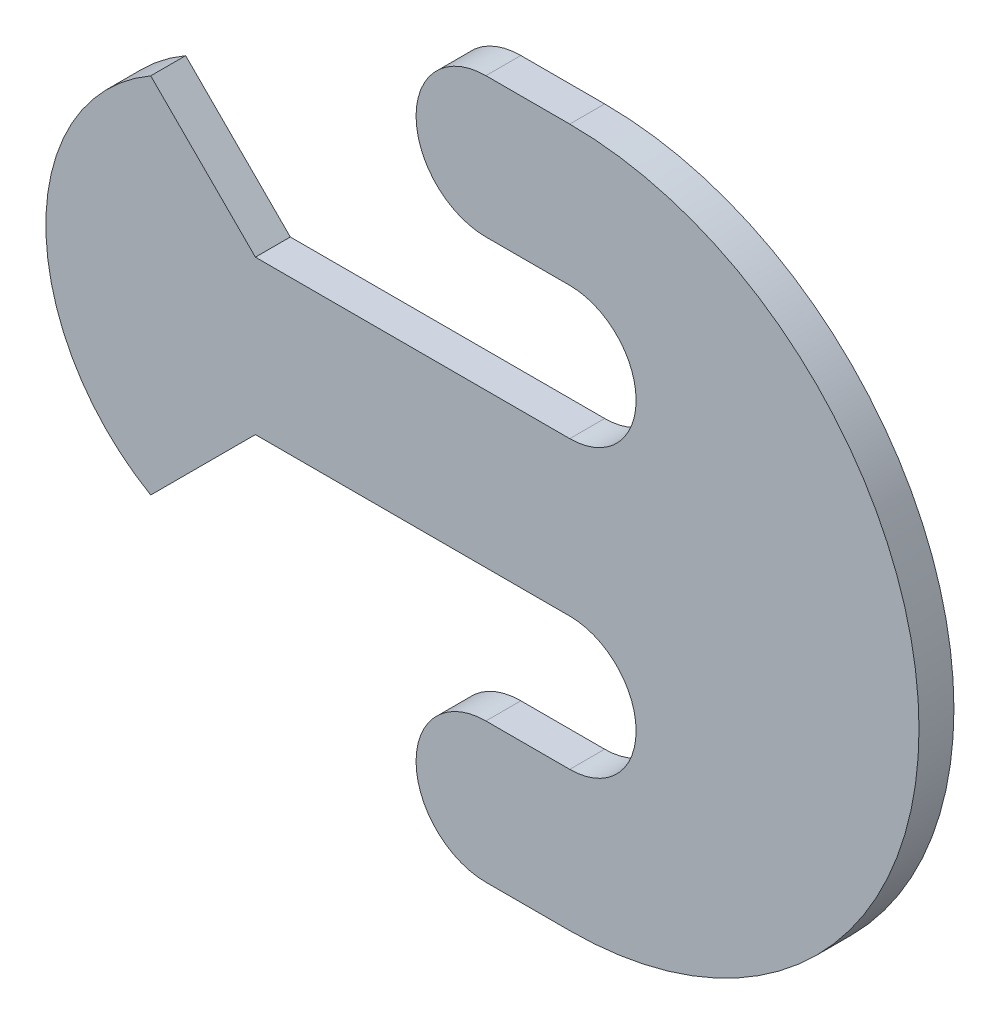
ISO-10303-21;
HEADER;
FILE_DESCRIPTION(('STEP AP214'),'2;1');
FILE_NAME('part.step','',(''),(''),'','','');
FILE_SCHEMA(('AUTOMOTIVE_DESIGN { 1 0 10303 214 1 1 1 1 }'));
ENDSEC;
DATA;
#1=APPLICATION_CONTEXT('core data for automotive mechanical design processes');
#2=APPLICATION_PROTOCOL_DEFINITION('international standard','automotive_design',2000,#1);
#3=PRODUCT_CONTEXT('',#1,'mechanical');
#4=PRODUCT('Part','Part','',(#3));
#5=PRODUCT_RELATED_PRODUCT_CATEGORY('part','',(#4));
#6=PRODUCT_DEFINITION_FORMATION('','',#4);
#7=PRODUCT_DEFINITION_CONTEXT('part definition',#1,'design');
#8=PRODUCT_DEFINITION('design','',#6,#7);
#9=PRODUCT_DEFINITION_SHAPE('','',#8);
#10=(LENGTH_UNIT() NAMED_UNIT(*) SI_UNIT(.MILLI.,.METRE.));
#11=(NAMED_UNIT(*) PLANE_ANGLE_UNIT() SI_UNIT($,.RADIAN.));
#12=(NAMED_UNIT(*) SI_UNIT($,.STERADIAN.) SOLID_ANGLE_UNIT());
#13=UNCERTAINTY_MEASURE_WITH_UNIT(LENGTH_MEASURE(1.E-05),#10,'distance_accuracy_value','');
#14=(GEOMETRIC_REPRESENTATION_CONTEXT(3) GLOBAL_UNCERTAINTY_ASSIGNED_CONTEXT((#13)) GLOBAL_UNIT_ASSIGNED_CONTEXT((#10,
#11,#12)) REPRESENTATION_CONTEXT('',''));
#15=CARTESIAN_POINT('',(0.,0.,0.));
#16=DIRECTION('',(0.,0.,1.));
#17=DIRECTION('',(1.,0.,0.));
#18=AXIS2_PLACEMENT_3D('',#15,#16,#17);
#19=CARTESIAN_POINT('',(11.,11.,5.));
#20=DIRECTION('',(-0.707106781186546,-0.707106781186549,0.));
#21=DIRECTION('',(0.707106781186549,-0.707106781186546,0.));
#22=AXIS2_PLACEMENT_3D('',#19,#20,#21);
#23=PLANE('',#22);
#24=DIRECTION('',(-0.707106781186549,0.707106781186546,0.));
#25=VECTOR('',#24,1.);
#26=CARTESIAN_POINT('',(11.,11.,0.));
#27=LINE('',#26,#25);
#28=CARTESIAN_POINT('',(0.,22.,0.));
#29=VERTEX_POINT('',#28);
#30=CARTESIAN_POINT('',(-14.9878012485479,36.9878012485478,0.));
#31=VERTEX_POINT('',#30);
#32=EDGE_CURVE('E168',#29,#31,#27,.T.);
#33=ORIENTED_EDGE('',*,*,#32,.T.);
#34=DIRECTION('',(0.,0.,-1.));
#35=VECTOR('',#34,1.);
#36=CARTESIAN_POINT('',(-14.9878012485479,36.9878012485478,5.));
#37=LINE('',#36,#35);
#38=CARTESIAN_POINT('',(-14.9878012485479,36.9878012485478,5.));
#39=VERTEX_POINT('',#38);
#40=EDGE_CURVE('E11',#39,#31,#37,.T.);
#41=ORIENTED_EDGE('',*,*,#40,.F.);
#42=DIRECTION('',(-0.707106781186549,0.707106781186546,0.));
#43=VECTOR('',#42,1.);
#44=CARTESIAN_POINT('',(11.,11.,5.));
#45=LINE('',#44,#43);
#46=CARTESIAN_POINT('',(0.,22.,5.));
#47=VERTEX_POINT('',#46);
#48=EDGE_CURVE('E203',#47,#39,#45,.T.);
#49=ORIENTED_EDGE('',*,*,#48,.F.);
#50=DIRECTION('',(0.,0.,-1.));
#51=VECTOR('',#50,1.);
#52=CARTESIAN_POINT('',(0.,22.,5.));
#53=LINE('',#52,#51);
#54=EDGE_CURVE('E51',#47,#29,#53,.T.);
#55=ORIENTED_EDGE('',*,*,#54,.T.);
#56=EDGE_LOOP('',(#33,#41,#49,#55));
#57=FACE_BOUND('',#56,.T.);
#58=ADVANCED_FACE('F35',(#57),#23,.F.);
#59=CARTESIAN_POINT('',(0.,11.,5.));
#60=DIRECTION('',(0.,0.,-1.));
#61=DIRECTION('',(-1.,0.,0.));
#62=AXIS2_PLACEMENT_3D('',#59,#60,#61);
#63=CYLINDRICAL_SURFACE('',#62,30.);
#64=CARTESIAN_POINT('',(0.,11.,0.));
#65=DIRECTION('',(0.,0.,1.));
#66=DIRECTION('',(1.,0.,0.));
#67=AXIS2_PLACEMENT_3D('',#64,#65,#66);
#68=CIRCLE('',#67,30.);
#69=CARTESIAN_POINT('',(-14.9878012485479,-14.9878012485479,0.));
#70=VERTEX_POINT('',#69);
#71=EDGE_CURVE('E170',#31,#70,#68,.T.);
#72=ORIENTED_EDGE('',*,*,#71,.T.);
#73=DIRECTION('',(0.,0.,-1.));
#74=VECTOR('',#73,1.);
#75=CARTESIAN_POINT('',(-14.9878012485479,-14.9878012485479,5.));
#76=LINE('',#75,#74);
#77=CARTESIAN_POINT('',(-14.9878012485479,-14.9878012485479,5.));
#78=VERTEX_POINT('',#77);
#79=EDGE_CURVE('E43',#78,#70,#76,.T.);
#80=ORIENTED_EDGE('',*,*,#79,.F.);
#81=CARTESIAN_POINT('',(0.,11.,5.));
#82=DIRECTION('',(0.,0.,1.));
#83=DIRECTION('',(1.,0.,0.));
#84=AXIS2_PLACEMENT_3D('',#81,#82,#83);
#85=CIRCLE('',#84,30.);
#86=EDGE_CURVE('E107',#39,#78,#85,.T.);
#87=ORIENTED_EDGE('',*,*,#86,.F.);
#88=ORIENTED_EDGE('',*,*,#40,.T.);
#89=EDGE_LOOP('',(#72,#80,#87,#88));
#90=FACE_BOUND('',#89,.T.);
#91=ADVANCED_FACE('F230',(#90),#63,.T.);
#92=CARTESIAN_POINT('',(0.,0.,5.));
#93=DIRECTION('',(0.707106781186546,-0.707106781186549,0.));
#94=DIRECTION('',(0.707106781186549,0.707106781186546,0.));
#95=AXIS2_PLACEMENT_3D('',#92,#93,#94);
#96=PLANE('',#95);
#97=DIRECTION('',(-0.707106781186549,-0.707106781186546,0.));
#98=VECTOR('',#97,1.);
#99=CARTESIAN_POINT('',(0.,0.,0.));
#100=LINE('',#99,#98);
#101=CARTESIAN_POINT('',(0.,0.,0.));
#102=VERTEX_POINT('',#101);
#103=EDGE_CURVE('E173',#102,#70,#100,.T.);
#104=ORIENTED_EDGE('',*,*,#103,.F.);
#105=DIRECTION('',(0.,0.,-1.));
#106=VECTOR('',#105,1.);
#107=CARTESIAN_POINT('',(0.,0.,5.));
#108=LINE('',#107,#106);
#109=CARTESIAN_POINT('',(0.,0.,5.));
#110=VERTEX_POINT('',#109);
#111=EDGE_CURVE('E223',#110,#102,#108,.T.);
#112=ORIENTED_EDGE('',*,*,#111,.F.);
#113=DIRECTION('',(-0.707106781186549,-0.707106781186546,0.));
#114=VECTOR('',#113,1.);
#115=CARTESIAN_POINT('',(0.,0.,5.));
#116=LINE('',#115,#114);
#117=EDGE_CURVE('E229',#110,#78,#116,.T.);
#118=ORIENTED_EDGE('',*,*,#117,.T.);
#119=ORIENTED_EDGE('',*,*,#79,.T.);
#120=EDGE_LOOP('',(#104,#112,#118,#119));
#121=FACE_BOUND('',#120,.T.);
#122=ADVANCED_FACE('F227',(#121),#96,.T.);
#123=CARTESIAN_POINT('',(0.,0.,5.));
#124=DIRECTION('',(0.,1.,0.));
#125=DIRECTION('',(0.,0.,1.));
#126=AXIS2_PLACEMENT_3D('',#123,#124,#125);
#127=PLANE('',#126);
#128=DIRECTION('',(1.,0.,0.));
#129=VECTOR('',#128,1.);
#130=CARTESIAN_POINT('',(0.,0.,0.));
#131=LINE('',#130,#129);
#132=CARTESIAN_POINT('',(45.,0.,0.));
#133=VERTEX_POINT('',#132);
#134=EDGE_CURVE('E176',#102,#133,#131,.T.);
#135=ORIENTED_EDGE('',*,*,#134,.T.);
#136=DIRECTION('',(0.,0.,-1.));
#137=VECTOR('',#136,1.);
#138=CARTESIAN_POINT('',(45.,0.,5.));
#139=LINE('',#138,#137);
#140=CARTESIAN_POINT('',(45.,0.,5.));
#141=VERTEX_POINT('',#140);
#142=EDGE_CURVE('E221',#141,#133,#139,.T.);
#143=ORIENTED_EDGE('',*,*,#142,.F.);
#144=DIRECTION('',(1.,0.,0.));
#145=VECTOR('',#144,1.);
#146=CARTESIAN_POINT('',(0.,0.,5.));
#147=LINE('',#146,#145);
#148=EDGE_CURVE('E241',#110,#141,#147,.T.);
#149=ORIENTED_EDGE('',*,*,#148,.F.);
#150=ORIENTED_EDGE('',*,*,#111,.T.);
#151=EDGE_LOOP('',(#135,#143,#149,#150));
#152=FACE_BOUND('',#151,.T.);
#153=ADVANCED_FACE('F238',(#152),#127,.F.);
#154=CARTESIAN_POINT('',(45.,-9.49999999999999,5.));
#155=DIRECTION('',(0.,0.,-1.));
#156=DIRECTION('',(-1.,0.,0.));
#157=AXIS2_PLACEMENT_3D('',#154,#155,#156);
#158=CYLINDRICAL_SURFACE('',#157,9.49999999999999);
#159=CARTESIAN_POINT('',(45.,-9.49999999999999,0.));
#160=DIRECTION('',(0.,0.,1.));
#161=DIRECTION('',(1.,0.,0.));
#162=AXIS2_PLACEMENT_3D('',#159,#160,#161);
#163=CIRCLE('',#162,9.49999999999999);
#164=CARTESIAN_POINT('',(45.,-19.,0.));
#165=VERTEX_POINT('',#164);
#166=EDGE_CURVE('E179',#165,#133,#163,.T.);
#167=ORIENTED_EDGE('',*,*,#166,.F.);
#168=DIRECTION('',(0.,0.,-1.));
#169=VECTOR('',#168,1.);
#170=CARTESIAN_POINT('',(45.,-19.,5.));
#171=LINE('',#170,#169);
#172=CARTESIAN_POINT('',(45.,-19.,5.));
#173=VERTEX_POINT('',#172);
#174=EDGE_CURVE('E219',#173,#165,#171,.T.);
#175=ORIENTED_EDGE('',*,*,#174,.F.);
#176=CARTESIAN_POINT('',(45.,-9.49999999999999,5.));
#177=DIRECTION('',(0.,0.,1.));
#178=DIRECTION('',(1.,0.,0.));
#179=AXIS2_PLACEMENT_3D('',#176,#177,#178);
#180=CIRCLE('',#179,9.49999999999999);
#181=EDGE_CURVE('E243',#173,#141,#180,.T.);
#182=ORIENTED_EDGE('',*,*,#181,.T.);
#183=ORIENTED_EDGE('',*,*,#142,.T.);
#184=EDGE_LOOP('',(#167,#175,#182,#183));
#185=FACE_BOUND('',#184,.T.);
#186=ADVANCED_FACE('F293',(#185),#158,.F.);
#187=CARTESIAN_POINT('',(0.,-19.,5.));
#188=DIRECTION('',(0.,1.,0.));
#189=DIRECTION('',(0.,0.,1.));
#190=AXIS2_PLACEMENT_3D('',#187,#188,#189);
#191=PLANE('',#190);
#192=DIRECTION('',(1.,0.,0.));
#193=VECTOR('',#192,1.);
#194=CARTESIAN_POINT('',(0.,-19.,0.));
#195=LINE('',#194,#193);
#196=CARTESIAN_POINT('',(33.,-19.,0.));
#197=VERTEX_POINT('',#196);
#198=EDGE_CURVE('E182',#197,#165,#195,.T.);
#199=ORIENTED_EDGE('',*,*,#198,.F.);
#200=DIRECTION('',(0.,0.,-1.));
#201=VECTOR('',#200,1.);
#202=CARTESIAN_POINT('',(33.,-19.,5.));
#203=LINE('',#202,#201);
#204=CARTESIAN_POINT('',(33.,-19.,5.));
#205=VERTEX_POINT('',#204);
#206=EDGE_CURVE('E217',#205,#197,#203,.T.);
#207=ORIENTED_EDGE('',*,*,#206,.F.);
#208=DIRECTION('',(1.,0.,0.));
#209=VECTOR('',#208,1.);
#210=CARTESIAN_POINT('',(0.,-19.,5.));
#211=LINE('',#210,#209);
#212=EDGE_CURVE('E250',#205,#173,#211,.T.);
#213=ORIENTED_EDGE('',*,*,#212,.T.);
#214=ORIENTED_EDGE('',*,*,#174,.T.);
#215=EDGE_LOOP('',(#199,#207,#213,#214));
#216=FACE_BOUND('',#215,.T.);
#217=ADVANCED_FACE('F296',(#216),#191,.T.);
#218=CARTESIAN_POINT('',(33.,-29.,5.));
#219=DIRECTION('',(0.,0.,-1.));
#220=DIRECTION('',(-1.,0.,0.));
#221=AXIS2_PLACEMENT_3D('',#218,#219,#220);
#222=CYLINDRICAL_SURFACE('',#221,10.);
#223=CARTESIAN_POINT('',(33.,-29.,0.));
#224=DIRECTION('',(0.,0.,1.));
#225=DIRECTION('',(1.,0.,0.));
#226=AXIS2_PLACEMENT_3D('',#223,#224,#225);
#227=CIRCLE('',#226,10.);
#228=CARTESIAN_POINT('',(33.,-39.,0.));
#229=VERTEX_POINT('',#228);
#230=EDGE_CURVE('E185',#197,#229,#227,.T.);
#231=ORIENTED_EDGE('',*,*,#230,.T.);
#232=DIRECTION('',(0.,0.,-1.));
#233=VECTOR('',#232,1.);
#234=CARTESIAN_POINT('',(33.,-39.,5.));
#235=LINE('',#234,#233);
#236=CARTESIAN_POINT('',(33.,-39.,5.));
#237=VERTEX_POINT('',#236);
#238=EDGE_CURVE('E215',#237,#229,#235,.T.);
#239=ORIENTED_EDGE('',*,*,#238,.F.);
#240=CARTESIAN_POINT('',(33.,-29.,5.));
#241=DIRECTION('',(0.,0.,1.));
#242=DIRECTION('',(1.,0.,0.));
#243=AXIS2_PLACEMENT_3D('',#240,#241,#242);
#244=CIRCLE('',#243,10.);
#245=EDGE_CURVE('E253',#205,#237,#244,.T.);
#246=ORIENTED_EDGE('',*,*,#245,.F.);
#247=ORIENTED_EDGE('',*,*,#206,.T.);
#248=EDGE_LOOP('',(#231,#239,#246,#247));
#249=FACE_BOUND('',#248,.T.);
#250=ADVANCED_FACE('F300',(#249),#222,.T.);
#251=CARTESIAN_POINT('',(0.,-39.,5.));
#252=DIRECTION('',(0.,-1.,0.));
#253=DIRECTION('',(0.,0.,-1.));
#254=AXIS2_PLACEMENT_3D('',#251,#252,#253);
#255=PLANE('',#254);
#256=DIRECTION('',(-1.,0.,0.));
#257=VECTOR('',#256,1.);
#258=CARTESIAN_POINT('',(0.,-39.,0.));
#259=LINE('',#258,#257);
#260=CARTESIAN_POINT('',(45.,-39.,0.));
#261=VERTEX_POINT('',#260);
#262=EDGE_CURVE('E188',#261,#229,#259,.T.);
#263=ORIENTED_EDGE('',*,*,#262,.F.);
#264=DIRECTION('',(0.,0.,-1.));
#265=VECTOR('',#264,1.);
#266=CARTESIAN_POINT('',(45.,-39.,5.));
#267=LINE('',#266,#265);
#268=CARTESIAN_POINT('',(45.,-39.,5.));
#269=VERTEX_POINT('',#268);
#270=EDGE_CURVE('E213',#269,#261,#267,.T.);
#271=ORIENTED_EDGE('',*,*,#270,.F.);
#272=DIRECTION('',(-1.,0.,0.));
#273=VECTOR('',#272,1.);
#274=CARTESIAN_POINT('',(0.,-39.,5.));
#275=LINE('',#274,#273);
#276=EDGE_CURVE('E255',#269,#237,#275,.T.);
#277=ORIENTED_EDGE('',*,*,#276,.T.);
#278=ORIENTED_EDGE('',*,*,#238,.T.);
#279=EDGE_LOOP('',(#263,#271,#277,#278));
#280=FACE_BOUND('',#279,.T.);
#281=ADVANCED_FACE('F304',(#280),#255,.T.);
#282=CARTESIAN_POINT('',(45.,11.,5.));
#283=DIRECTION('',(0.,0.,-1.));
#284=DIRECTION('',(-1.,0.,0.));
#285=AXIS2_PLACEMENT_3D('',#282,#283,#284);
#286=CYLINDRICAL_SURFACE('',#285,50.);
#287=CARTESIAN_POINT('',(45.,11.,0.));
#288=DIRECTION('',(0.,0.,1.));
#289=DIRECTION('',(1.,0.,0.));
#290=AXIS2_PLACEMENT_3D('',#287,#288,#289);
#291=CIRCLE('',#290,50.);
#292=CARTESIAN_POINT('',(45.,61.,0.));
#293=VERTEX_POINT('',#292);
#294=EDGE_CURVE('E191',#261,#293,#291,.T.);
#295=ORIENTED_EDGE('',*,*,#294,.T.);
#296=DIRECTION('',(0.,0.,-1.));
#297=VECTOR('',#296,1.);
#298=CARTESIAN_POINT('',(45.,61.,5.));
#299=LINE('',#298,#297);
#300=CARTESIAN_POINT('',(45.,61.,5.));
#301=VERTEX_POINT('',#300);
#302=EDGE_CURVE('E210',#301,#293,#299,.T.);
#303=ORIENTED_EDGE('',*,*,#302,.F.);
#304=CARTESIAN_POINT('',(45.,11.,5.));
#305=DIRECTION('',(0.,0.,1.));
#306=DIRECTION('',(1.,0.,0.));
#307=AXIS2_PLACEMENT_3D('',#304,#305,#306);
#308=CIRCLE('',#307,50.);
#309=EDGE_CURVE('E258',#269,#301,#308,.T.);
#310=ORIENTED_EDGE('',*,*,#309,.F.);
#311=ORIENTED_EDGE('',*,*,#270,.T.);
#312=EDGE_LOOP('',(#295,#303,#310,#311));
#313=FACE_BOUND('',#312,.T.);
#314=ADVANCED_FACE('F308',(#313),#286,.T.);
#315=CARTESIAN_POINT('',(0.,61.,5.));
#316=DIRECTION('',(0.,-1.,0.));
#317=DIRECTION('',(1.,0.,0.));
#318=AXIS2_PLACEMENT_3D('',#315,#316,#317);
#319=PLANE('',#318);
#320=DIRECTION('',(-1.,0.,0.));
#321=VECTOR('',#320,1.);
#322=CARTESIAN_POINT('',(0.,61.,0.));
#323=LINE('',#322,#321);
#324=CARTESIAN_POINT('',(33.,61.,0.));
#325=VERTEX_POINT('',#324);
#326=EDGE_CURVE('E193',#293,#325,#323,.T.);
#327=ORIENTED_EDGE('',*,*,#326,.T.);
#328=DIRECTION('',(0.,0.,-1.));
#329=VECTOR('',#328,1.);
#330=CARTESIAN_POINT('',(33.,61.,5.));
#331=LINE('',#330,#329);
#332=CARTESIAN_POINT('',(33.,61.,5.));
#333=VERTEX_POINT('',#332);
#334=EDGE_CURVE('E207',#333,#325,#331,.T.);
#335=ORIENTED_EDGE('',*,*,#334,.F.);
#336=DIRECTION('',(-1.,0.,0.));
#337=VECTOR('',#336,1.);
#338=CARTESIAN_POINT('',(0.,61.,5.));
#339=LINE('',#338,#337);
#340=EDGE_CURVE('E260',#301,#333,#339,.T.);
#341=ORIENTED_EDGE('',*,*,#340,.F.);
#342=ORIENTED_EDGE('',*,*,#302,.T.);
#343=EDGE_LOOP('',(#327,#335,#341,#342));
#344=FACE_BOUND('',#343,.T.);
#345=ADVANCED_FACE('F267',(#344),#319,.F.);
#346=CARTESIAN_POINT('',(33.,51.,5.));
#347=DIRECTION('',(0.,0.,-1.));
#348=DIRECTION('',(-1.,0.,0.));
#349=AXIS2_PLACEMENT_3D('',#346,#347,#348);
#350=CYLINDRICAL_SURFACE('',#349,10.);
#351=CARTESIAN_POINT('',(33.,51.,0.));
#352=DIRECTION('',(0.,0.,1.));
#353=DIRECTION('',(1.,0.,0.));
#354=AXIS2_PLACEMENT_3D('',#351,#352,#353);
#355=CIRCLE('',#354,10.);
#356=CARTESIAN_POINT('',(33.,41.,0.));
#357=VERTEX_POINT('',#356);
#358=EDGE_CURVE('E195',#325,#357,#355,.T.);
#359=ORIENTED_EDGE('',*,*,#358,.T.);
#360=DIRECTION('',(0.,0.,-1.));
#361=VECTOR('',#360,1.);
#362=CARTESIAN_POINT('',(33.,41.,5.));
#363=LINE('',#362,#361);
#364=CARTESIAN_POINT('',(33.,41.,5.));
#365=VERTEX_POINT('',#364);
#366=EDGE_CURVE('E160',#365,#357,#363,.T.);
#367=ORIENTED_EDGE('',*,*,#366,.F.);
#368=CARTESIAN_POINT('',(33.,51.,5.));
#369=DIRECTION('',(0.,0.,1.));
#370=DIRECTION('',(1.,0.,0.));
#371=AXIS2_PLACEMENT_3D('',#368,#369,#370);
#372=CIRCLE('',#371,10.);
#373=EDGE_CURVE('E148',#333,#365,#372,.T.);
#374=ORIENTED_EDGE('',*,*,#373,.F.);
#375=ORIENTED_EDGE('',*,*,#334,.T.);
#376=EDGE_LOOP('',(#359,#367,#374,#375));
#377=FACE_BOUND('',#376,.T.);
#378=ADVANCED_FACE('F271',(#377),#350,.T.);
#379=CARTESIAN_POINT('',(0.,41.,5.));
#380=DIRECTION('',(0.,1.,0.));
#381=DIRECTION('',(0.,0.,1.));
#382=AXIS2_PLACEMENT_3D('',#379,#380,#381);
#383=PLANE('',#382);
#384=DIRECTION('',(1.,0.,0.));
#385=VECTOR('',#384,1.);
#386=CARTESIAN_POINT('',(0.,41.,0.));
#387=LINE('',#386,#385);
#388=CARTESIAN_POINT('',(45.,41.,0.));
#389=VERTEX_POINT('',#388);
#390=EDGE_CURVE('E157',#357,#389,#387,.T.);
#391=ORIENTED_EDGE('',*,*,#390,.T.);
#392=DIRECTION('',(0.,0.,-1.));
#393=VECTOR('',#392,1.);
#394=CARTESIAN_POINT('',(45.,41.,5.));
#395=LINE('',#394,#393);
#396=CARTESIAN_POINT('',(45.,41.,5.));
#397=VERTEX_POINT('',#396);
#398=EDGE_CURVE('E154',#397,#389,#395,.T.);
#399=ORIENTED_EDGE('',*,*,#398,.F.);
#400=DIRECTION('',(1.,0.,0.));
#401=VECTOR('',#400,1.);
#402=CARTESIAN_POINT('',(0.,41.,5.));
#403=LINE('',#402,#401);
#404=EDGE_CURVE('E141',#365,#397,#403,.T.);
#405=ORIENTED_EDGE('',*,*,#404,.F.);
#406=ORIENTED_EDGE('',*,*,#366,.T.);
#407=EDGE_LOOP('',(#391,#399,#405,#406));
#408=FACE_BOUND('',#407,.T.);
#409=ADVANCED_FACE('F155',(#408),#383,.F.);
#410=CARTESIAN_POINT('',(45.,31.5,5.));
#411=DIRECTION('',(0.,0.,-1.));
#412=DIRECTION('',(-1.,0.,0.));
#413=AXIS2_PLACEMENT_3D('',#410,#411,#412);
#414=CYLINDRICAL_SURFACE('',#413,9.5);
#415=CARTESIAN_POINT('',(45.,31.5,0.));
#416=DIRECTION('',(0.,0.,1.));
#417=DIRECTION('',(1.,0.,0.));
#418=AXIS2_PLACEMENT_3D('',#415,#416,#417);
#419=CIRCLE('',#418,9.5);
#420=CARTESIAN_POINT('',(45.,22.,0.));
#421=VERTEX_POINT('',#420);
#422=EDGE_CURVE('E198',#421,#389,#419,.T.);
#423=ORIENTED_EDGE('',*,*,#422,.F.);
#424=DIRECTION('',(0.,0.,-1.));
#425=VECTOR('',#424,1.);
#426=CARTESIAN_POINT('',(45.,22.,5.));
#427=LINE('',#426,#425);
#428=CARTESIAN_POINT('',(45.,22.,5.));
#429=VERTEX_POINT('',#428);
#430=EDGE_CURVE('E95',#429,#421,#427,.T.);
#431=ORIENTED_EDGE('',*,*,#430,.F.);
#432=CARTESIAN_POINT('',(45.,31.5,5.));
#433=DIRECTION('',(0.,0.,1.));
#434=DIRECTION('',(1.,0.,0.));
#435=AXIS2_PLACEMENT_3D('',#432,#433,#434);
#436=CIRCLE('',#435,9.5);
#437=EDGE_CURVE('E146',#429,#397,#436,.T.);
#438=ORIENTED_EDGE('',*,*,#437,.T.);
#439=ORIENTED_EDGE('',*,*,#398,.T.);
#440=EDGE_LOOP('',(#423,#431,#438,#439));
#441=FACE_BOUND('',#440,.T.);
#442=ADVANCED_FACE('F162',(#441),#414,.F.);
#443=CARTESIAN_POINT('',(0.,22.,5.));
#444=DIRECTION('',(0.,1.,0.));
#445=DIRECTION('',(-1.,0.,0.));
#446=AXIS2_PLACEMENT_3D('',#443,#444,#445);
#447=PLANE('',#446);
#448=DIRECTION('',(1.,0.,0.));
#449=VECTOR('',#448,1.);
#450=CARTESIAN_POINT('',(0.,22.,0.));
#451=LINE('',#450,#449);
#452=EDGE_CURVE('E200',#29,#421,#451,.T.);
#453=ORIENTED_EDGE('',*,*,#452,.F.);
#454=ORIENTED_EDGE('',*,*,#54,.F.);
#455=DIRECTION('',(1.,0.,0.));
#456=VECTOR('',#455,1.);
#457=CARTESIAN_POINT('',(0.,22.,5.));
#458=LINE('',#457,#456);
#459=EDGE_CURVE('E163',#47,#429,#458,.T.);
#460=ORIENTED_EDGE('',*,*,#459,.T.);
#461=ORIENTED_EDGE('',*,*,#430,.T.);
#462=EDGE_LOOP('',(#453,#454,#460,#461));
#463=FACE_BOUND('',#462,.T.);
#464=ADVANCED_FACE('F272',(#463),#447,.T.);
#465=CARTESIAN_POINT('',(0.,0.,5.));
#466=DIRECTION('',(0.,0.,1.));
#467=DIRECTION('',(1.,0.,0.));
#468=AXIS2_PLACEMENT_3D('',#465,#466,#467);
#469=PLANE('',#468);
#470=ORIENTED_EDGE('',*,*,#48,.T.);
#471=ORIENTED_EDGE('',*,*,#86,.T.);
#472=ORIENTED_EDGE('',*,*,#117,.F.);
#473=ORIENTED_EDGE('',*,*,#148,.T.);
#474=ORIENTED_EDGE('',*,*,#181,.F.);
#475=ORIENTED_EDGE('',*,*,#212,.F.);
#476=ORIENTED_EDGE('',*,*,#245,.T.);
#477=ORIENTED_EDGE('',*,*,#276,.F.);
#478=ORIENTED_EDGE('',*,*,#309,.T.);
#479=ORIENTED_EDGE('',*,*,#340,.T.);
#480=ORIENTED_EDGE('',*,*,#373,.T.);
#481=ORIENTED_EDGE('',*,*,#404,.T.);
#482=ORIENTED_EDGE('',*,*,#437,.F.);
#483=ORIENTED_EDGE('',*,*,#459,.F.);
#484=EDGE_LOOP('',(#470,#471,#472,#473,#474,#475,#476,#477,#478,#479,#480,#481,#482,#483));
#485=FACE_BOUND('',#484,.T.);
#486=ADVANCED_FACE('F143',(#485),#469,.T.);
#487=CARTESIAN_POINT('',(0.,0.,0.));
#488=DIRECTION('',(0.,0.,1.));
#489=DIRECTION('',(1.,0.,0.));
#490=AXIS2_PLACEMENT_3D('',#487,#488,#489);
#491=PLANE('',#490);
#492=ORIENTED_EDGE('',*,*,#32,.F.);
#493=ORIENTED_EDGE('',*,*,#452,.T.);
#494=ORIENTED_EDGE('',*,*,#422,.T.);
#495=ORIENTED_EDGE('',*,*,#390,.F.);
#496=ORIENTED_EDGE('',*,*,#358,.F.);
#497=ORIENTED_EDGE('',*,*,#326,.F.);
#498=ORIENTED_EDGE('',*,*,#294,.F.);
#499=ORIENTED_EDGE('',*,*,#262,.T.);
#500=ORIENTED_EDGE('',*,*,#230,.F.);
#501=ORIENTED_EDGE('',*,*,#198,.T.);
#502=ORIENTED_EDGE('',*,*,#166,.T.);
#503=ORIENTED_EDGE('',*,*,#134,.F.);
#504=ORIENTED_EDGE('',*,*,#103,.T.);
#505=ORIENTED_EDGE('',*,*,#71,.F.);
#506=EDGE_LOOP('',(#492,#493,#494,#495,#496,#497,#498,#499,#500,#501,#502,#503,#504,#505));
#507=FACE_BOUND('',#506,.T.);
#508=ADVANCED_FACE('F234',(#507),#491,.F.);
#509=CLOSED_SHELL('',(#58,#91,#122,#153,#186,#217,#250,#281,#314,#345,#378,#409,#442,#464,#486,#508));
#510=MANIFOLD_SOLID_BREP('B2',#509);
#511=ADVANCED_BREP_SHAPE_REPRESENTATION('',(#18,#510),#14);
#512=SHAPE_DEFINITION_REPRESENTATION(#9,#511);
ENDSEC;
END-ISO-10303-21;
